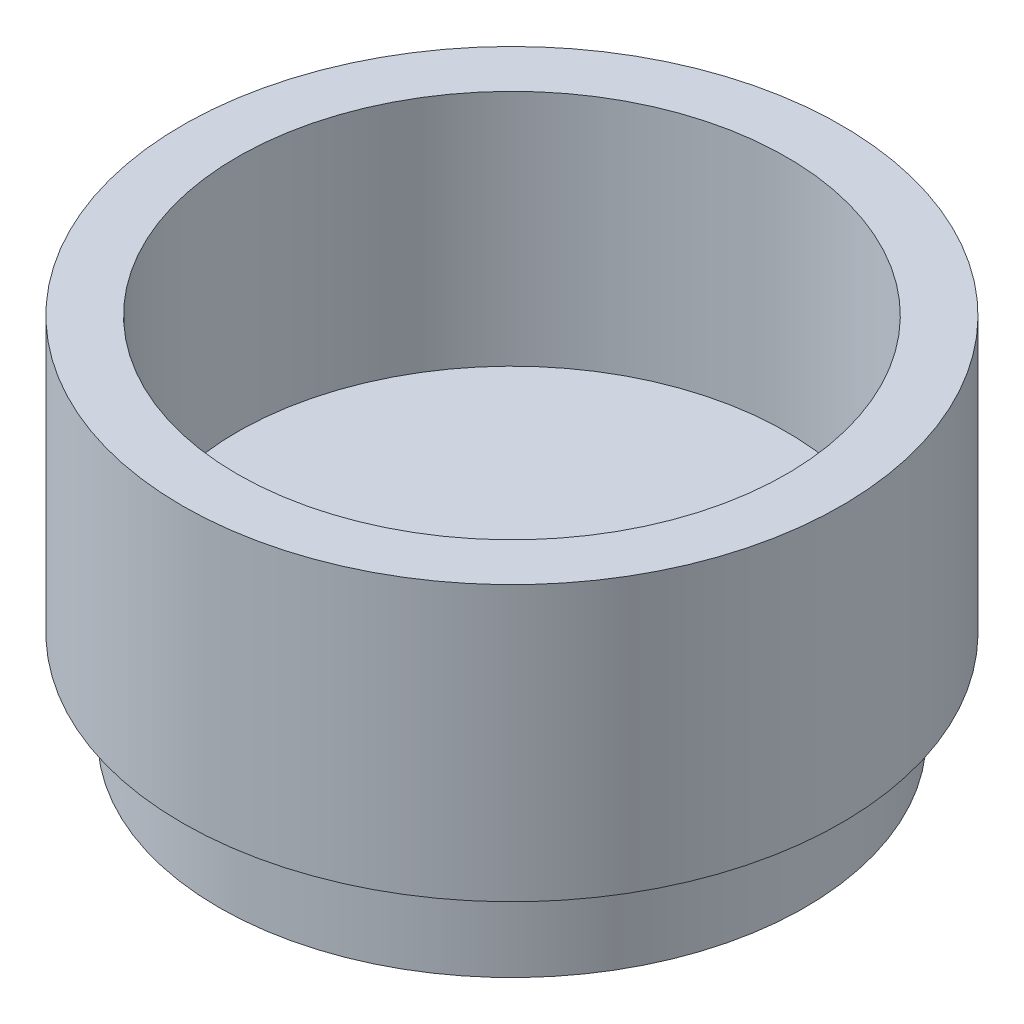
ISO-10303-21;
HEADER;
FILE_DESCRIPTION(('STEP AP214'),'2;1');
FILE_NAME('part.step','',(''),(''),'','','');
FILE_SCHEMA(('AUTOMOTIVE_DESIGN { 1 0 10303 214 1 1 1 1 }'));
ENDSEC;
DATA;
#1=APPLICATION_CONTEXT('core data for automotive mechanical design processes');
#2=APPLICATION_PROTOCOL_DEFINITION('international standard','automotive_design',2000,#1);
#3=PRODUCT_CONTEXT('',#1,'mechanical');
#4=PRODUCT('Part','Part','',(#3));
#5=PRODUCT_RELATED_PRODUCT_CATEGORY('part','',(#4));
#6=PRODUCT_DEFINITION_FORMATION('','',#4);
#7=PRODUCT_DEFINITION_CONTEXT('part definition',#1,'design');
#8=PRODUCT_DEFINITION('design','',#6,#7);
#9=PRODUCT_DEFINITION_SHAPE('','',#8);
#10=(LENGTH_UNIT() NAMED_UNIT(*) SI_UNIT(.MILLI.,.METRE.));
#11=(NAMED_UNIT(*) PLANE_ANGLE_UNIT() SI_UNIT($,.RADIAN.));
#12=(NAMED_UNIT(*) SI_UNIT($,.STERADIAN.) SOLID_ANGLE_UNIT());
#13=UNCERTAINTY_MEASURE_WITH_UNIT(LENGTH_MEASURE(1.E-05),#10,'distance_accuracy_value','');
#14=(GEOMETRIC_REPRESENTATION_CONTEXT(3) GLOBAL_UNCERTAINTY_ASSIGNED_CONTEXT((#13)) GLOBAL_UNIT_ASSIGNED_CONTEXT((#10,
#11,#12)) REPRESENTATION_CONTEXT('',''));
#15=CARTESIAN_POINT('',(0.,0.,0.));
#16=DIRECTION('',(0.,0.,1.));
#17=DIRECTION('',(1.,0.,0.));
#18=AXIS2_PLACEMENT_3D('',#15,#16,#17);
#19=CARTESIAN_POINT('',(0.,50.,0.));
#20=DIRECTION('',(0.,-1.,0.));
#21=DIRECTION('',(0.,0.,-1.));
#22=AXIS2_PLACEMENT_3D('',#19,#20,#21);
#23=CYLINDRICAL_SURFACE('',#22,160.);
#24=CARTESIAN_POINT('',(0.,50.,0.));
#25=DIRECTION('',(0.,1.,0.));
#26=DIRECTION('',(0.,0.,1.));
#27=AXIS2_PLACEMENT_3D('',#24,#25,#26);
#28=CIRCLE('',#27,160.);
#29=CARTESIAN_POINT('',(0.,50.,160.));
#30=VERTEX_POINT('',#29);
#31=EDGE_CURVE('E10',#30,#30,#28,.T.);
#32=ORIENTED_EDGE('',*,*,#31,.F.);
#33=EDGE_LOOP('',(#32));
#34=FACE_BOUND('',#33,.T.);
#35=CARTESIAN_POINT('',(0.,0.,0.));
#36=DIRECTION('',(0.,1.,0.));
#37=DIRECTION('',(0.,0.,1.));
#38=AXIS2_PLACEMENT_3D('',#35,#36,#37);
#39=CIRCLE('',#38,160.);
#40=CARTESIAN_POINT('',(0.,0.,160.));
#41=VERTEX_POINT('',#40);
#42=EDGE_CURVE('E34',#41,#41,#39,.T.);
#43=ORIENTED_EDGE('',*,*,#42,.T.);
#44=EDGE_LOOP('',(#43));
#45=FACE_BOUND('',#44,.T.);
#46=ADVANCED_FACE('F31',(#34,#45),#23,.T.);
#47=CARTESIAN_POINT('',(0.,0.,0.));
#48=DIRECTION('',(0.,1.,0.));
#49=DIRECTION('',(0.,0.,1.));
#50=AXIS2_PLACEMENT_3D('',#47,#48,#49);
#51=PLANE('',#50);
#52=ORIENTED_EDGE('',*,*,#42,.F.);
#53=EDGE_LOOP('',(#52));
#54=FACE_BOUND('',#53,.T.);
#55=ADVANCED_FACE('F73',(#54),#51,.F.);
#56=CARTESIAN_POINT('',(0.,200.,0.));
#57=DIRECTION('',(0.,-1.,0.));
#58=DIRECTION('',(0.,0.,-1.));
#59=AXIS2_PLACEMENT_3D('',#56,#57,#58);
#60=CYLINDRICAL_SURFACE('',#59,180.);
#61=CARTESIAN_POINT('',(0.,200.,0.));
#62=DIRECTION('',(0.,1.,0.));
#63=DIRECTION('',(0.,0.,1.));
#64=AXIS2_PLACEMENT_3D('',#61,#62,#63);
#65=CIRCLE('',#64,180.);
#66=CARTESIAN_POINT('',(0.,200.,180.));
#67=VERTEX_POINT('',#66);
#68=EDGE_CURVE('E41',#67,#67,#65,.T.);
#69=ORIENTED_EDGE('',*,*,#68,.F.);
#70=EDGE_LOOP('',(#69));
#71=FACE_BOUND('',#70,.T.);
#72=CARTESIAN_POINT('',(0.,50.,0.));
#73=DIRECTION('',(0.,1.,0.));
#74=DIRECTION('',(0.,0.,1.));
#75=AXIS2_PLACEMENT_3D('',#72,#73,#74);
#76=CIRCLE('',#75,180.);
#77=CARTESIAN_POINT('',(0.,50.,180.));
#78=VERTEX_POINT('',#77);
#79=EDGE_CURVE('E43',#78,#78,#76,.T.);
#80=ORIENTED_EDGE('',*,*,#79,.T.);
#81=EDGE_LOOP('',(#80));
#82=FACE_BOUND('',#81,.T.);
#83=ADVANCED_FACE('F67',(#71,#82),#60,.T.);
#84=CARTESIAN_POINT('',(0.,200.,0.));
#85=DIRECTION('',(0.,1.,0.));
#86=DIRECTION('',(0.,0.,1.));
#87=AXIS2_PLACEMENT_3D('',#84,#85,#86);
#88=PLANE('',#87);
#89=CARTESIAN_POINT('',(0.,200.,0.));
#90=DIRECTION('',(0.,1.,0.));
#91=DIRECTION('',(0.,0.,1.));
#92=AXIS2_PLACEMENT_3D('',#89,#90,#91);
#93=CIRCLE('',#92,150.);
#94=CARTESIAN_POINT('',(0.,200.,150.));
#95=VERTEX_POINT('',#94);
#96=EDGE_CURVE('E49',#95,#95,#93,.T.);
#97=ORIENTED_EDGE('',*,*,#96,.F.);
#98=EDGE_LOOP('',(#97));
#99=FACE_BOUND('',#98,.T.);
#100=ORIENTED_EDGE('',*,*,#68,.T.);
#101=EDGE_LOOP('',(#100));
#102=FACE_BOUND('',#101,.T.);
#103=ADVANCED_FACE('F64',(#99,#102),#88,.T.);
#104=CARTESIAN_POINT('',(0.,50.,0.));
#105=DIRECTION('',(0.,1.,0.));
#106=DIRECTION('',(0.,0.,1.));
#107=AXIS2_PLACEMENT_3D('',#104,#105,#106);
#108=PLANE('',#107);
#109=ORIENTED_EDGE('',*,*,#31,.T.);
#110=EDGE_LOOP('',(#109));
#111=FACE_BOUND('',#110,.T.);
#112=ORIENTED_EDGE('',*,*,#79,.F.);
#113=EDGE_LOOP('',(#112));
#114=FACE_BOUND('',#113,.T.);
#115=ADVANCED_FACE('F60',(#111,#114),#108,.F.);
#116=CARTESIAN_POINT('',(0.,70.,0.));
#117=DIRECTION('',(0.,1.,0.));
#118=DIRECTION('',(0.,0.,1.));
#119=AXIS2_PLACEMENT_3D('',#116,#117,#118);
#120=CYLINDRICAL_SURFACE('',#119,150.);
#121=CARTESIAN_POINT('',(0.,70.,0.));
#122=DIRECTION('',(0.,1.,0.));
#123=DIRECTION('',(0.,0.,1.));
#124=AXIS2_PLACEMENT_3D('',#121,#122,#123);
#125=CIRCLE('',#124,150.);
#126=CARTESIAN_POINT('',(0.,70.,150.));
#127=VERTEX_POINT('',#126);
#128=EDGE_CURVE('E46',#127,#127,#125,.T.);
#129=ORIENTED_EDGE('',*,*,#128,.F.);
#130=EDGE_LOOP('',(#129));
#131=FACE_BOUND('',#130,.T.);
#132=ORIENTED_EDGE('',*,*,#96,.T.);
#133=EDGE_LOOP('',(#132));
#134=FACE_BOUND('',#133,.T.);
#135=ADVANCED_FACE('F57',(#131,#134),#120,.F.);
#136=CARTESIAN_POINT('',(0.,70.,0.));
#137=DIRECTION('',(0.,1.,0.));
#138=DIRECTION('',(0.,0.,1.));
#139=AXIS2_PLACEMENT_3D('',#136,#137,#138);
#140=PLANE('',#139);
#141=ORIENTED_EDGE('',*,*,#128,.T.);
#142=EDGE_LOOP('',(#141));
#143=FACE_BOUND('',#142,.T.);
#144=ADVANCED_FACE('F55',(#143),#140,.T.);
#145=CLOSED_SHELL('',(#46,#55,#83,#103,#115,#135,#144));
#146=MANIFOLD_SOLID_BREP('B2',#145);
#147=ADVANCED_BREP_SHAPE_REPRESENTATION('',(#18,#146),#14);
#148=SHAPE_DEFINITION_REPRESENTATION(#9,#147);
ENDSEC;
END-ISO-10303-21;
